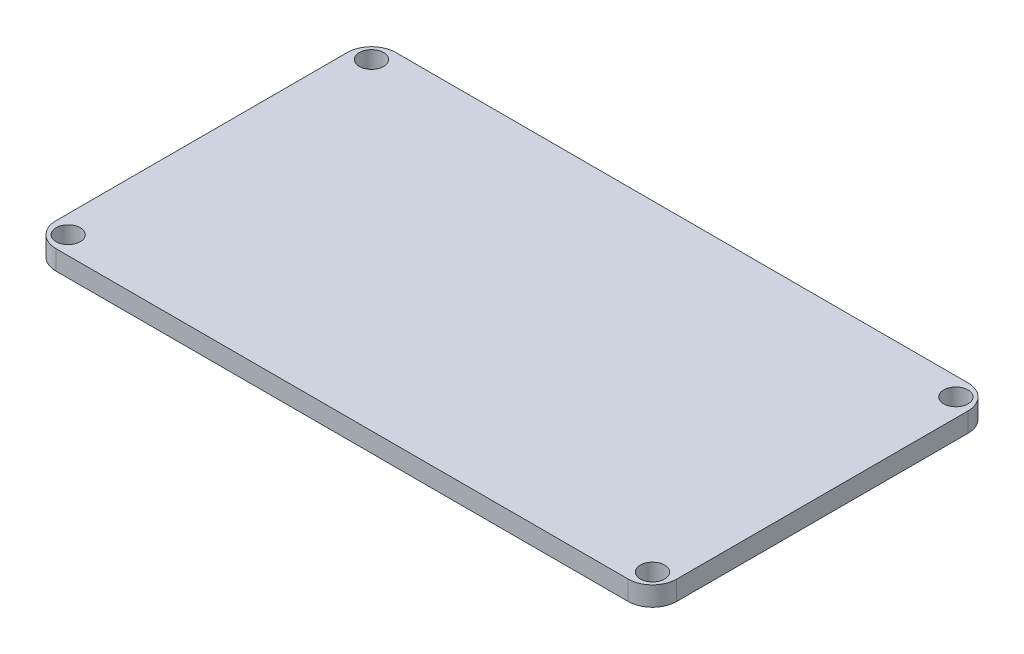
ISO-10303-21;
HEADER;
FILE_DESCRIPTION(('STEP AP214'),'2;1');
FILE_NAME('part.step','',(''),(''),'','','');
FILE_SCHEMA(('AUTOMOTIVE_DESIGN { 1 0 10303 214 1 1 1 1 }'));
ENDSEC;
DATA;
#1=APPLICATION_CONTEXT('core data for automotive mechanical design processes');
#2=APPLICATION_PROTOCOL_DEFINITION('international standard','automotive_design',2000,#1);
#3=PRODUCT_CONTEXT('',#1,'mechanical');
#4=PRODUCT('Part','Part','',(#3));
#5=PRODUCT_RELATED_PRODUCT_CATEGORY('part','',(#4));
#6=PRODUCT_DEFINITION_FORMATION('','',#4);
#7=PRODUCT_DEFINITION_CONTEXT('part definition',#1,'design');
#8=PRODUCT_DEFINITION('design','',#6,#7);
#9=PRODUCT_DEFINITION_SHAPE('','',#8);
#10=(LENGTH_UNIT() NAMED_UNIT(*) SI_UNIT(.MILLI.,.METRE.));
#11=(NAMED_UNIT(*) PLANE_ANGLE_UNIT() SI_UNIT($,.RADIAN.));
#12=(NAMED_UNIT(*) SI_UNIT($,.STERADIAN.) SOLID_ANGLE_UNIT());
#13=UNCERTAINTY_MEASURE_WITH_UNIT(LENGTH_MEASURE(1.E-05),#10,'distance_accuracy_value','');
#14=(GEOMETRIC_REPRESENTATION_CONTEXT(3) GLOBAL_UNCERTAINTY_ASSIGNED_CONTEXT((#13)) GLOBAL_UNIT_ASSIGNED_CONTEXT((#10,
#11,#12)) REPRESENTATION_CONTEXT('',''));
#15=CARTESIAN_POINT('',(0.,0.,0.));
#16=DIRECTION('',(0.,0.,1.));
#17=DIRECTION('',(1.,0.,0.));
#18=AXIS2_PLACEMENT_3D('',#15,#16,#17);
#19=CARTESIAN_POINT('',(0.,0.,0.));
#20=DIRECTION('',(0.,-1.,0.));
#21=DIRECTION('',(0.,0.,-1.));
#22=AXIS2_PLACEMENT_3D('',#19,#20,#21);
#23=PLANE('',#22);
#24=CARTESIAN_POINT('',(-24.0750000000004,0.,12.5));
#25=DIRECTION('',(0.,1.,0.));
#26=DIRECTION('',(0.,0.,1.));
#27=AXIS2_PLACEMENT_3D('',#24,#25,#26);
#28=CIRCLE('',#27,1.00000000000005);
#29=CARTESIAN_POINT('',(-24.0750000000004,0.,13.5000000000001));
#30=VERTEX_POINT('',#29);
#31=EDGE_CURVE('E151',#30,#30,#28,.T.);
#32=ORIENTED_EDGE('',*,*,#31,.T.);
#33=EDGE_LOOP('',(#32));
#34=FACE_BOUND('',#33,.T.);
#35=CARTESIAN_POINT('',(24.0750000000004,0.,12.5));
#36=DIRECTION('',(0.,1.,0.));
#37=DIRECTION('',(0.,0.,1.));
#38=AXIS2_PLACEMENT_3D('',#35,#36,#37);
#39=CIRCLE('',#38,1.00000000000005);
#40=CARTESIAN_POINT('',(24.0750000000004,0.,13.5000000000001));
#41=VERTEX_POINT('',#40);
#42=EDGE_CURVE('E163',#41,#41,#39,.T.);
#43=ORIENTED_EDGE('',*,*,#42,.T.);
#44=EDGE_LOOP('',(#43));
#45=FACE_BOUND('',#44,.T.);
#46=CARTESIAN_POINT('',(24.0750000000004,0.,-12.5));
#47=DIRECTION('',(0.,1.,0.));
#48=DIRECTION('',(0.,0.,1.));
#49=AXIS2_PLACEMENT_3D('',#46,#47,#48);
#50=CIRCLE('',#49,1.00000000000005);
#51=CARTESIAN_POINT('',(24.0750000000004,0.,-11.5));
#52=VERTEX_POINT('',#51);
#53=EDGE_CURVE('E156',#52,#52,#50,.T.);
#54=ORIENTED_EDGE('',*,*,#53,.T.);
#55=EDGE_LOOP('',(#54));
#56=FACE_BOUND('',#55,.T.);
#57=CARTESIAN_POINT('',(-24.0750000000004,0.,-12.5));
#58=DIRECTION('',(0.,1.,0.));
#59=DIRECTION('',(0.,0.,1.));
#60=AXIS2_PLACEMENT_3D('',#57,#58,#59);
#61=CIRCLE('',#60,1.00000000000005);
#62=CARTESIAN_POINT('',(-24.0750000000004,0.,-11.5));
#63=VERTEX_POINT('',#62);
#64=EDGE_CURVE('E171',#63,#63,#61,.T.);
#65=ORIENTED_EDGE('',*,*,#64,.T.);
#66=EDGE_LOOP('',(#65));
#67=FACE_BOUND('',#66,.T.);
#68=DIRECTION('',(-1.,0.,0.));
#69=VECTOR('',#68,1.);
#70=CARTESIAN_POINT('',(25.5749999999998,0.,-14.));
#71=LINE('',#70,#69);
#72=CARTESIAN_POINT('',(23.5749999999998,0.,-14.));
#73=VERTEX_POINT('',#72);
#74=CARTESIAN_POINT('',(-23.5750000000002,0.,-14.));
#75=VERTEX_POINT('',#74);
#76=EDGE_CURVE('E181',#73,#75,#71,.T.);
#77=ORIENTED_EDGE('',*,*,#76,.F.);
#78=CARTESIAN_POINT('',(23.5749999999998,0.,-12.));
#79=DIRECTION('',(0.,-1.,0.));
#80=DIRECTION('',(0.,0.,-1.));
#81=AXIS2_PLACEMENT_3D('',#78,#79,#80);
#82=CIRCLE('',#81,2.);
#83=CARTESIAN_POINT('',(25.5749999999998,0.,-12.));
#84=VERTEX_POINT('',#83);
#85=EDGE_CURVE('E209',#73,#84,#82,.T.);
#86=ORIENTED_EDGE('',*,*,#85,.T.);
#87=DIRECTION('',(0.,0.,-1.));
#88=VECTOR('',#87,1.);
#89=CARTESIAN_POINT('',(25.5749999999998,0.,-14.));
#90=LINE('',#89,#88);
#91=CARTESIAN_POINT('',(25.5749999999999,0.,11.9999999999999));
#92=VERTEX_POINT('',#91);
#93=EDGE_CURVE('E194',#92,#84,#90,.T.);
#94=ORIENTED_EDGE('',*,*,#93,.F.);
#95=CARTESIAN_POINT('',(23.5749999999999,0.,12.));
#96=DIRECTION('',(0.,-1.,0.));
#97=DIRECTION('',(0.,0.,-1.));
#98=AXIS2_PLACEMENT_3D('',#95,#96,#97);
#99=CIRCLE('',#98,2.);
#100=CARTESIAN_POINT('',(23.5749999999999,0.,14.));
#101=VERTEX_POINT('',#100);
#102=EDGE_CURVE('E207',#92,#101,#99,.T.);
#103=ORIENTED_EDGE('',*,*,#102,.T.);
#104=DIRECTION('',(1.,0.,0.));
#105=VECTOR('',#104,1.);
#106=CARTESIAN_POINT('',(25.5749999999999,0.,14.));
#107=LINE('',#106,#105);
#108=CARTESIAN_POINT('',(-23.5750000000002,0.,14.));
#109=VERTEX_POINT('',#108);
#110=EDGE_CURVE('E192',#109,#101,#107,.T.);
#111=ORIENTED_EDGE('',*,*,#110,.F.);
#112=CARTESIAN_POINT('',(-23.5750000000002,0.,12.));
#113=DIRECTION('',(0.,-1.,0.));
#114=DIRECTION('',(0.,0.,-1.));
#115=AXIS2_PLACEMENT_3D('',#112,#113,#114);
#116=CIRCLE('',#115,2.);
#117=CARTESIAN_POINT('',(-25.5750000000002,0.,12.));
#118=VERTEX_POINT('',#117);
#119=EDGE_CURVE('E205',#109,#118,#116,.T.);
#120=ORIENTED_EDGE('',*,*,#119,.T.);
#121=DIRECTION('',(0.,0.,1.));
#122=VECTOR('',#121,1.);
#123=CARTESIAN_POINT('',(-25.5750000000002,0.,-14.));
#124=LINE('',#123,#122);
#125=CARTESIAN_POINT('',(-25.5750000000002,0.,-12.));
#126=VERTEX_POINT('',#125);
#127=EDGE_CURVE('E174',#126,#118,#124,.T.);
#128=ORIENTED_EDGE('',*,*,#127,.F.);
#129=CARTESIAN_POINT('',(-23.5750000000002,0.,-12.));
#130=DIRECTION('',(0.,-1.,0.));
#131=DIRECTION('',(0.,0.,-1.));
#132=AXIS2_PLACEMENT_3D('',#129,#130,#131);
#133=CIRCLE('',#132,2.);
#134=EDGE_CURVE('E203',#126,#75,#133,.T.);
#135=ORIENTED_EDGE('',*,*,#134,.T.);
#136=EDGE_LOOP('',(#77,#86,#94,#103,#111,#120,#128,#135));
#137=FACE_BOUND('',#136,.T.);
#138=DIRECTION('',(-1.,0.,0.));
#139=VECTOR('',#138,1.);
#140=CARTESIAN_POINT('',(-9.125,0.,4.5));
#141=LINE('',#140,#139);
#142=CARTESIAN_POINT('',(9.125,0.,4.5));
#143=VERTEX_POINT('',#142);
#144=CARTESIAN_POINT('',(-9.125,0.,4.5));
#145=VERTEX_POINT('',#144);
#146=EDGE_CURVE('E451',#143,#145,#141,.T.);
#147=ORIENTED_EDGE('',*,*,#146,.F.);
#148=DIRECTION('',(0.,0.,1.));
#149=VECTOR('',#148,1.);
#150=CARTESIAN_POINT('',(9.125,0.,-4.5));
#151=LINE('',#150,#149);
#152=CARTESIAN_POINT('',(9.125,0.,-4.5));
#153=VERTEX_POINT('',#152);
#154=EDGE_CURVE('E146',#153,#143,#151,.T.);
#155=ORIENTED_EDGE('',*,*,#154,.F.);
#156=DIRECTION('',(1.,0.,0.));
#157=VECTOR('',#156,1.);
#158=CARTESIAN_POINT('',(-9.125,0.,-4.5));
#159=LINE('',#158,#157);
#160=CARTESIAN_POINT('',(-9.125,0.,-4.5));
#161=VERTEX_POINT('',#160);
#162=EDGE_CURVE('E142',#161,#153,#159,.T.);
#163=ORIENTED_EDGE('',*,*,#162,.F.);
#164=DIRECTION('',(0.,0.,-1.));
#165=VECTOR('',#164,1.);
#166=CARTESIAN_POINT('',(-9.125,0.,-4.5));
#167=LINE('',#166,#165);
#168=EDGE_CURVE('E448',#145,#161,#167,.T.);
#169=ORIENTED_EDGE('',*,*,#168,.F.);
#170=EDGE_LOOP('',(#147,#155,#163,#169));
#171=FACE_BOUND('',#170,.T.);
#172=ADVANCED_FACE('F33',(#34,#45,#56,#67,#137,#171),#23,.T.);
#173=CARTESIAN_POINT('',(-25.5750000000002,1.6,-14.));
#174=DIRECTION('',(1.,0.,0.));
#175=DIRECTION('',(0.,0.,-1.));
#176=AXIS2_PLACEMENT_3D('',#173,#174,#175);
#177=PLANE('',#176);
#178=ORIENTED_EDGE('',*,*,#127,.T.);
#179=DIRECTION('',(0.,-1.,0.));
#180=VECTOR('',#179,1.);
#181=CARTESIAN_POINT('',(-25.5750000000002,1.6,12.));
#182=LINE('',#181,#180);
#183=CARTESIAN_POINT('',(-25.5750000000002,1.6,12.));
#184=VERTEX_POINT('',#183);
#185=EDGE_CURVE('E11',#118,#184,#182,.F.);
#186=ORIENTED_EDGE('',*,*,#185,.T.);
#187=DIRECTION('',(0.,0.,1.));
#188=VECTOR('',#187,1.);
#189=CARTESIAN_POINT('',(-25.5750000000002,1.6,-14.));
#190=LINE('',#189,#188);
#191=CARTESIAN_POINT('',(-25.5750000000002,1.6,-12.));
#192=VERTEX_POINT('',#191);
#193=EDGE_CURVE('E177',#192,#184,#190,.T.);
#194=ORIENTED_EDGE('',*,*,#193,.F.);
#195=DIRECTION('',(0.,-1.,0.));
#196=VECTOR('',#195,1.);
#197=CARTESIAN_POINT('',(-25.5750000000002,1.6,-12.));
#198=LINE('',#197,#196);
#199=EDGE_CURVE('E41',#192,#126,#198,.T.);
#200=ORIENTED_EDGE('',*,*,#199,.T.);
#201=EDGE_LOOP('',(#178,#186,#194,#200));
#202=FACE_BOUND('',#201,.T.);
#203=ADVANCED_FACE('F232',(#202),#177,.F.);
#204=CARTESIAN_POINT('',(25.5749999999999,1.6,14.));
#205=DIRECTION('',(0.,0.,-1.));
#206=DIRECTION('',(-1.,0.,0.));
#207=AXIS2_PLACEMENT_3D('',#204,#205,#206);
#208=PLANE('',#207);
#209=ORIENTED_EDGE('',*,*,#110,.T.);
#210=DIRECTION('',(0.,-1.,0.));
#211=VECTOR('',#210,1.);
#212=CARTESIAN_POINT('',(23.5749999999999,1.6,14.));
#213=LINE('',#212,#211);
#214=CARTESIAN_POINT('',(23.5749999999999,1.6,14.));
#215=VERTEX_POINT('',#214);
#216=EDGE_CURVE('E56',#101,#215,#213,.F.);
#217=ORIENTED_EDGE('',*,*,#216,.T.);
#218=DIRECTION('',(1.,0.,0.));
#219=VECTOR('',#218,1.);
#220=CARTESIAN_POINT('',(25.5749999999999,1.6,14.));
#221=LINE('',#220,#219);
#222=CARTESIAN_POINT('',(-23.5750000000002,1.6,14.));
#223=VERTEX_POINT('',#222);
#224=EDGE_CURVE('E180',#223,#215,#221,.T.);
#225=ORIENTED_EDGE('',*,*,#224,.F.);
#226=DIRECTION('',(0.,-1.,0.));
#227=VECTOR('',#226,1.);
#228=CARTESIAN_POINT('',(-23.5750000000002,1.6,14.));
#229=LINE('',#228,#227);
#230=EDGE_CURVE('E224',#223,#109,#229,.T.);
#231=ORIENTED_EDGE('',*,*,#230,.T.);
#232=EDGE_LOOP('',(#209,#217,#225,#231));
#233=FACE_BOUND('',#232,.T.);
#234=ADVANCED_FACE('F244',(#233),#208,.F.);
#235=CARTESIAN_POINT('',(25.5749999999998,1.6,-14.));
#236=DIRECTION('',(-1.,0.,0.));
#237=DIRECTION('',(0.,0.,1.));
#238=AXIS2_PLACEMENT_3D('',#235,#236,#237);
#239=PLANE('',#238);
#240=ORIENTED_EDGE('',*,*,#93,.T.);
#241=DIRECTION('',(0.,-1.,0.));
#242=VECTOR('',#241,1.);
#243=CARTESIAN_POINT('',(25.5749999999998,1.6,-12.));
#244=LINE('',#243,#242);
#245=CARTESIAN_POINT('',(25.5749999999998,1.6,-12.));
#246=VERTEX_POINT('',#245);
#247=EDGE_CURVE('E214',#84,#246,#244,.F.);
#248=ORIENTED_EDGE('',*,*,#247,.T.);
#249=DIRECTION('',(0.,0.,-1.));
#250=VECTOR('',#249,1.);
#251=CARTESIAN_POINT('',(25.5749999999998,1.6,-14.));
#252=LINE('',#251,#250);
#253=CARTESIAN_POINT('',(25.5749999999999,1.6,11.9999999999999));
#254=VERTEX_POINT('',#253);
#255=EDGE_CURVE('E183',#254,#246,#252,.T.);
#256=ORIENTED_EDGE('',*,*,#255,.F.);
#257=DIRECTION('',(0.,-1.,0.));
#258=VECTOR('',#257,1.);
#259=CARTESIAN_POINT('',(25.5749999999999,1.6,12.));
#260=LINE('',#259,#258);
#261=EDGE_CURVE('E211',#254,#92,#260,.T.);
#262=ORIENTED_EDGE('',*,*,#261,.T.);
#263=EDGE_LOOP('',(#240,#248,#256,#262));
#264=FACE_BOUND('',#263,.T.);
#265=ADVANCED_FACE('F254',(#264),#239,.F.);
#266=CARTESIAN_POINT('',(25.5749999999998,1.6,-14.));
#267=DIRECTION('',(0.,0.,1.));
#268=DIRECTION('',(1.,0.,0.));
#269=AXIS2_PLACEMENT_3D('',#266,#267,#268);
#270=PLANE('',#269);
#271=DIRECTION('',(-1.,0.,0.));
#272=VECTOR('',#271,1.);
#273=CARTESIAN_POINT('',(25.5749999999998,1.6,-14.));
#274=LINE('',#273,#272);
#275=CARTESIAN_POINT('',(23.5749999999998,1.6,-14.));
#276=VERTEX_POINT('',#275);
#277=CARTESIAN_POINT('',(-23.5750000000002,1.6,-14.));
#278=VERTEX_POINT('',#277);
#279=EDGE_CURVE('E186',#276,#278,#274,.T.);
#280=ORIENTED_EDGE('',*,*,#279,.F.);
#281=DIRECTION('',(0.,-1.,0.));
#282=VECTOR('',#281,1.);
#283=CARTESIAN_POINT('',(23.5749999999998,1.6,-14.));
#284=LINE('',#283,#282);
#285=EDGE_CURVE('E200',#276,#73,#284,.T.);
#286=ORIENTED_EDGE('',*,*,#285,.T.);
#287=ORIENTED_EDGE('',*,*,#76,.T.);
#288=DIRECTION('',(0.,-1.,0.));
#289=VECTOR('',#288,1.);
#290=CARTESIAN_POINT('',(-23.5750000000002,1.6,-14.));
#291=LINE('',#290,#289);
#292=EDGE_CURVE('E189',#75,#278,#291,.F.);
#293=ORIENTED_EDGE('',*,*,#292,.T.);
#294=EDGE_LOOP('',(#280,#286,#287,#293));
#295=FACE_BOUND('',#294,.T.);
#296=ADVANCED_FACE('F262',(#295),#270,.F.);
#297=CARTESIAN_POINT('',(0.,1.6,0.));
#298=DIRECTION('',(0.,-1.,0.));
#299=DIRECTION('',(0.,0.,-1.));
#300=AXIS2_PLACEMENT_3D('',#297,#298,#299);
#301=PLANE('',#300);
#302=CARTESIAN_POINT('',(-24.0750000000004,1.6,12.5));
#303=DIRECTION('',(0.,1.,0.));
#304=DIRECTION('',(0.,0.,1.));
#305=AXIS2_PLACEMENT_3D('',#302,#303,#304);
#306=CIRCLE('',#305,1.00000000000005);
#307=CARTESIAN_POINT('',(-24.0750000000004,1.6,13.5000000000001));
#308=VERTEX_POINT('',#307);
#309=EDGE_CURVE('E148',#308,#308,#306,.T.);
#310=ORIENTED_EDGE('',*,*,#309,.F.);
#311=EDGE_LOOP('',(#310));
#312=FACE_BOUND('',#311,.T.);
#313=CARTESIAN_POINT('',(24.0750000000004,1.6,12.5));
#314=DIRECTION('',(0.,1.,0.));
#315=DIRECTION('',(0.,0.,1.));
#316=AXIS2_PLACEMENT_3D('',#313,#314,#315);
#317=CIRCLE('',#316,1.00000000000005);
#318=CARTESIAN_POINT('',(24.0750000000004,1.6,13.5000000000001));
#319=VERTEX_POINT('',#318);
#320=EDGE_CURVE('E166',#319,#319,#317,.T.);
#321=ORIENTED_EDGE('',*,*,#320,.F.);
#322=EDGE_LOOP('',(#321));
#323=FACE_BOUND('',#322,.T.);
#324=CARTESIAN_POINT('',(24.0750000000004,1.6,-12.5));
#325=DIRECTION('',(0.,1.,0.));
#326=DIRECTION('',(0.,0.,1.));
#327=AXIS2_PLACEMENT_3D('',#324,#325,#326);
#328=CIRCLE('',#327,1.00000000000005);
#329=CARTESIAN_POINT('',(24.0750000000004,1.6,-11.5));
#330=VERTEX_POINT('',#329);
#331=EDGE_CURVE('E160',#330,#330,#328,.T.);
#332=ORIENTED_EDGE('',*,*,#331,.F.);
#333=EDGE_LOOP('',(#332));
#334=FACE_BOUND('',#333,.T.);
#335=CARTESIAN_POINT('',(-24.0750000000004,1.6,-12.5));
#336=DIRECTION('',(0.,1.,0.));
#337=DIRECTION('',(0.,0.,1.));
#338=AXIS2_PLACEMENT_3D('',#335,#336,#337);
#339=CIRCLE('',#338,1.00000000000005);
#340=CARTESIAN_POINT('',(-24.0750000000004,1.6,-11.5));
#341=VERTEX_POINT('',#340);
#342=EDGE_CURVE('E159',#341,#341,#339,.T.);
#343=ORIENTED_EDGE('',*,*,#342,.F.);
#344=EDGE_LOOP('',(#343));
#345=FACE_BOUND('',#344,.T.);
#346=ORIENTED_EDGE('',*,*,#255,.T.);
#347=CARTESIAN_POINT('',(23.5749999999998,1.6,-12.));
#348=DIRECTION('',(0.,-1.,0.));
#349=DIRECTION('',(0.,0.,-1.));
#350=AXIS2_PLACEMENT_3D('',#347,#348,#349);
#351=CIRCLE('',#350,2.);
#352=EDGE_CURVE('E222',#246,#276,#351,.F.);
#353=ORIENTED_EDGE('',*,*,#352,.T.);
#354=ORIENTED_EDGE('',*,*,#279,.T.);
#355=CARTESIAN_POINT('',(-23.5750000000002,1.6,-12.));
#356=DIRECTION('',(0.,-1.,0.));
#357=DIRECTION('',(0.,0.,-1.));
#358=AXIS2_PLACEMENT_3D('',#355,#356,#357);
#359=CIRCLE('',#358,2.);
#360=EDGE_CURVE('E216',#278,#192,#359,.F.);
#361=ORIENTED_EDGE('',*,*,#360,.T.);
#362=ORIENTED_EDGE('',*,*,#193,.T.);
#363=CARTESIAN_POINT('',(-23.5750000000002,1.6,12.));
#364=DIRECTION('',(0.,-1.,0.));
#365=DIRECTION('',(0.,0.,-1.));
#366=AXIS2_PLACEMENT_3D('',#363,#364,#365);
#367=CIRCLE('',#366,2.);
#368=EDGE_CURVE('E218',#184,#223,#367,.F.);
#369=ORIENTED_EDGE('',*,*,#368,.T.);
#370=ORIENTED_EDGE('',*,*,#224,.T.);
#371=CARTESIAN_POINT('',(23.5749999999999,1.6,12.));
#372=DIRECTION('',(0.,-1.,0.));
#373=DIRECTION('',(0.,0.,-1.));
#374=AXIS2_PLACEMENT_3D('',#371,#372,#373);
#375=CIRCLE('',#374,2.);
#376=EDGE_CURVE('E220',#215,#254,#375,.F.);
#377=ORIENTED_EDGE('',*,*,#376,.T.);
#378=EDGE_LOOP('',(#346,#353,#354,#361,#362,#369,#370,#377));
#379=FACE_BOUND('',#378,.T.);
#380=ADVANCED_FACE('F247',(#312,#323,#334,#345,#379),#301,.F.);
#381=CARTESIAN_POINT('',(-24.0750000000004,0.,-12.5));
#382=DIRECTION('',(0.,1.,0.));
#383=DIRECTION('',(0.,0.,1.));
#384=AXIS2_PLACEMENT_3D('',#381,#382,#383);
#385=CYLINDRICAL_SURFACE('',#384,1.00000000000005);
#386=ORIENTED_EDGE('',*,*,#64,.F.);
#387=EDGE_LOOP('',(#386));
#388=FACE_BOUND('',#387,.T.);
#389=ORIENTED_EDGE('',*,*,#342,.T.);
#390=EDGE_LOOP('',(#389));
#391=FACE_BOUND('',#390,.T.);
#392=ADVANCED_FACE('F358',(#388,#391),#385,.F.);
#393=CARTESIAN_POINT('',(24.0750000000004,0.,-12.5));
#394=DIRECTION('',(0.,1.,0.));
#395=DIRECTION('',(0.,0.,1.));
#396=AXIS2_PLACEMENT_3D('',#393,#394,#395);
#397=CYLINDRICAL_SURFACE('',#396,1.00000000000005);
#398=ORIENTED_EDGE('',*,*,#53,.F.);
#399=EDGE_LOOP('',(#398));
#400=FACE_BOUND('',#399,.T.);
#401=ORIENTED_EDGE('',*,*,#331,.T.);
#402=EDGE_LOOP('',(#401));
#403=FACE_BOUND('',#402,.T.);
#404=ADVANCED_FACE('F354',(#400,#403),#397,.F.);
#405=CARTESIAN_POINT('',(24.0750000000004,0.,12.5));
#406=DIRECTION('',(0.,1.,0.));
#407=DIRECTION('',(0.,0.,1.));
#408=AXIS2_PLACEMENT_3D('',#405,#406,#407);
#409=CYLINDRICAL_SURFACE('',#408,1.00000000000005);
#410=ORIENTED_EDGE('',*,*,#42,.F.);
#411=EDGE_LOOP('',(#410));
#412=FACE_BOUND('',#411,.T.);
#413=ORIENTED_EDGE('',*,*,#320,.T.);
#414=EDGE_LOOP('',(#413));
#415=FACE_BOUND('',#414,.T.);
#416=ADVANCED_FACE('F357',(#412,#415),#409,.F.);
#417=CARTESIAN_POINT('',(-24.0750000000004,0.,12.5));
#418=DIRECTION('',(0.,1.,0.));
#419=DIRECTION('',(0.,0.,1.));
#420=AXIS2_PLACEMENT_3D('',#417,#418,#419);
#421=CYLINDRICAL_SURFACE('',#420,1.00000000000005);
#422=ORIENTED_EDGE('',*,*,#31,.F.);
#423=EDGE_LOOP('',(#422));
#424=FACE_BOUND('',#423,.T.);
#425=ORIENTED_EDGE('',*,*,#309,.T.);
#426=EDGE_LOOP('',(#425));
#427=FACE_BOUND('',#426,.T.);
#428=ADVANCED_FACE('F289',(#424,#427),#421,.F.);
#429=CARTESIAN_POINT('',(23.5749999999998,1.6,-12.));
#430=DIRECTION('',(0.,-1.,0.));
#431=DIRECTION('',(0.,0.,-1.));
#432=AXIS2_PLACEMENT_3D('',#429,#430,#431);
#433=CYLINDRICAL_SURFACE('',#432,2.);
#434=ORIENTED_EDGE('',*,*,#352,.F.);
#435=ORIENTED_EDGE('',*,*,#247,.F.);
#436=ORIENTED_EDGE('',*,*,#85,.F.);
#437=ORIENTED_EDGE('',*,*,#285,.F.);
#438=EDGE_LOOP('',(#434,#435,#436,#437));
#439=FACE_BOUND('',#438,.T.);
#440=ADVANCED_FACE('F259',(#439),#433,.T.);
#441=CARTESIAN_POINT('',(23.5749999999999,1.6,12.));
#442=DIRECTION('',(0.,-1.,0.));
#443=DIRECTION('',(0.,0.,-1.));
#444=AXIS2_PLACEMENT_3D('',#441,#442,#443);
#445=CYLINDRICAL_SURFACE('',#444,2.);
#446=ORIENTED_EDGE('',*,*,#376,.F.);
#447=ORIENTED_EDGE('',*,*,#216,.F.);
#448=ORIENTED_EDGE('',*,*,#102,.F.);
#449=ORIENTED_EDGE('',*,*,#261,.F.);
#450=EDGE_LOOP('',(#446,#447,#448,#449));
#451=FACE_BOUND('',#450,.T.);
#452=ADVANCED_FACE('F251',(#451),#445,.T.);
#453=CARTESIAN_POINT('',(-23.5750000000002,1.6,12.));
#454=DIRECTION('',(0.,-1.,0.));
#455=DIRECTION('',(0.,0.,-1.));
#456=AXIS2_PLACEMENT_3D('',#453,#454,#455);
#457=CYLINDRICAL_SURFACE('',#456,2.);
#458=ORIENTED_EDGE('',*,*,#368,.F.);
#459=ORIENTED_EDGE('',*,*,#185,.F.);
#460=ORIENTED_EDGE('',*,*,#119,.F.);
#461=ORIENTED_EDGE('',*,*,#230,.F.);
#462=EDGE_LOOP('',(#458,#459,#460,#461));
#463=FACE_BOUND('',#462,.T.);
#464=ADVANCED_FACE('F243',(#463),#457,.T.);
#465=CARTESIAN_POINT('',(-23.5750000000002,1.6,-12.));
#466=DIRECTION('',(0.,-1.,0.));
#467=DIRECTION('',(0.,0.,-1.));
#468=AXIS2_PLACEMENT_3D('',#465,#466,#467);
#469=CYLINDRICAL_SURFACE('',#468,2.);
#470=ORIENTED_EDGE('',*,*,#360,.F.);
#471=ORIENTED_EDGE('',*,*,#292,.F.);
#472=ORIENTED_EDGE('',*,*,#134,.F.);
#473=ORIENTED_EDGE('',*,*,#199,.F.);
#474=EDGE_LOOP('',(#470,#471,#472,#473));
#475=FACE_BOUND('',#474,.T.);
#476=ADVANCED_FACE('F35',(#475),#469,.T.);
#477=CARTESIAN_POINT('',(9.125,-2.36,-4.5));
#478=DIRECTION('',(-1.,0.,0.));
#479=DIRECTION('',(0.,0.,1.));
#480=AXIS2_PLACEMENT_3D('',#477,#478,#479);
#481=PLANE('',#480);
#482=ORIENTED_EDGE('',*,*,#154,.T.);
#483=DIRECTION('',(0.,1.,0.));
#484=VECTOR('',#483,1.);
#485=CARTESIAN_POINT('',(9.125,-2.36,4.5));
#486=LINE('',#485,#484);
#487=CARTESIAN_POINT('',(9.125,-2.36,4.5));
#488=VERTEX_POINT('',#487);
#489=EDGE_CURVE('E127',#488,#143,#486,.T.);
#490=ORIENTED_EDGE('',*,*,#489,.F.);
#491=DIRECTION('',(0.,0.,1.));
#492=VECTOR('',#491,1.);
#493=CARTESIAN_POINT('',(9.125,-2.36,-4.5));
#494=LINE('',#493,#492);
#495=CARTESIAN_POINT('',(9.125,-2.36,-4.5));
#496=VERTEX_POINT('',#495);
#497=EDGE_CURVE('E134',#496,#488,#494,.T.);
#498=ORIENTED_EDGE('',*,*,#497,.F.);
#499=DIRECTION('',(0.,1.,0.));
#500=VECTOR('',#499,1.);
#501=CARTESIAN_POINT('',(9.125,-2.36,-4.5));
#502=LINE('',#501,#500);
#503=EDGE_CURVE('E446',#496,#153,#502,.T.);
#504=ORIENTED_EDGE('',*,*,#503,.T.);
#505=EDGE_LOOP('',(#482,#490,#498,#504));
#506=FACE_BOUND('',#505,.T.);
#507=ADVANCED_FACE('F144',(#506),#481,.F.);
#508=CARTESIAN_POINT('',(-9.125,-2.36,4.5));
#509=DIRECTION('',(0.,0.,-1.));
#510=DIRECTION('',(-1.,0.,0.));
#511=AXIS2_PLACEMENT_3D('',#508,#509,#510);
#512=PLANE('',#511);
#513=ORIENTED_EDGE('',*,*,#146,.T.);
#514=DIRECTION('',(0.,1.,0.));
#515=VECTOR('',#514,1.);
#516=CARTESIAN_POINT('',(-9.125,-2.36,4.5));
#517=LINE('',#516,#515);
#518=CARTESIAN_POINT('',(-9.125,-2.36,4.5));
#519=VERTEX_POINT('',#518);
#520=EDGE_CURVE('E130',#519,#145,#517,.T.);
#521=ORIENTED_EDGE('',*,*,#520,.F.);
#522=DIRECTION('',(-1.,0.,0.));
#523=VECTOR('',#522,1.);
#524=CARTESIAN_POINT('',(-9.125,-2.36,4.5));
#525=LINE('',#524,#523);
#526=EDGE_CURVE('E123',#488,#519,#525,.T.);
#527=ORIENTED_EDGE('',*,*,#526,.F.);
#528=ORIENTED_EDGE('',*,*,#489,.T.);
#529=EDGE_LOOP('',(#513,#521,#527,#528));
#530=FACE_BOUND('',#529,.T.);
#531=ADVANCED_FACE('F125',(#530),#512,.F.);
#532=CARTESIAN_POINT('',(-9.125,-2.36,-4.5));
#533=DIRECTION('',(1.,0.,0.));
#534=DIRECTION('',(0.,0.,-1.));
#535=AXIS2_PLACEMENT_3D('',#532,#533,#534);
#536=PLANE('',#535);
#537=ORIENTED_EDGE('',*,*,#168,.T.);
#538=DIRECTION('',(0.,1.,0.));
#539=VECTOR('',#538,1.);
#540=CARTESIAN_POINT('',(-9.125,-2.36,-4.5));
#541=LINE('',#540,#539);
#542=CARTESIAN_POINT('',(-9.125,-2.36,-4.5));
#543=VERTEX_POINT('',#542);
#544=EDGE_CURVE('E48',#543,#161,#541,.T.);
#545=ORIENTED_EDGE('',*,*,#544,.F.);
#546=DIRECTION('',(0.,0.,-1.));
#547=VECTOR('',#546,1.);
#548=CARTESIAN_POINT('',(-9.125,-2.36,-4.5));
#549=LINE('',#548,#547);
#550=EDGE_CURVE('E133',#519,#543,#549,.T.);
#551=ORIENTED_EDGE('',*,*,#550,.F.);
#552=ORIENTED_EDGE('',*,*,#520,.T.);
#553=EDGE_LOOP('',(#537,#545,#551,#552));
#554=FACE_BOUND('',#553,.T.);
#555=ADVANCED_FACE('F323',(#554),#536,.F.);
#556=CARTESIAN_POINT('',(-9.125,-2.36,-4.5));
#557=DIRECTION('',(0.,0.,1.));
#558=DIRECTION('',(1.,0.,0.));
#559=AXIS2_PLACEMENT_3D('',#556,#557,#558);
#560=PLANE('',#559);
#561=ORIENTED_EDGE('',*,*,#162,.T.);
#562=ORIENTED_EDGE('',*,*,#503,.F.);
#563=DIRECTION('',(1.,0.,0.));
#564=VECTOR('',#563,1.);
#565=CARTESIAN_POINT('',(-9.125,-2.36,-4.5));
#566=LINE('',#565,#564);
#567=EDGE_CURVE('E138',#543,#496,#566,.T.);
#568=ORIENTED_EDGE('',*,*,#567,.F.);
#569=ORIENTED_EDGE('',*,*,#544,.T.);
#570=EDGE_LOOP('',(#561,#562,#568,#569));
#571=FACE_BOUND('',#570,.T.);
#572=ADVANCED_FACE('F332',(#571),#560,.F.);
#573=CARTESIAN_POINT('',(0.,-2.36,0.));
#574=DIRECTION('',(0.,1.,0.));
#575=DIRECTION('',(0.,0.,1.));
#576=AXIS2_PLACEMENT_3D('',#573,#574,#575);
#577=PLANE('',#576);
#578=ORIENTED_EDGE('',*,*,#497,.T.);
#579=ORIENTED_EDGE('',*,*,#526,.T.);
#580=ORIENTED_EDGE('',*,*,#550,.T.);
#581=ORIENTED_EDGE('',*,*,#567,.T.);
#582=EDGE_LOOP('',(#578,#579,#580,#581));
#583=FACE_BOUND('',#582,.T.);
#584=ADVANCED_FACE('F137',(#583),#577,.F.);
#585=CLOSED_SHELL('',(#172,#203,#234,#265,#296,#380,#392,#404,#416,#428,#440,#452,#464,#476,
#507,#531,#555,#572,#584));
#586=MANIFOLD_SOLID_BREP('B2',#585);
#587=ADVANCED_BREP_SHAPE_REPRESENTATION('',(#18,#586),#14);
#588=SHAPE_DEFINITION_REPRESENTATION(#9,#587);
ENDSEC;
END-ISO-10303-21;
